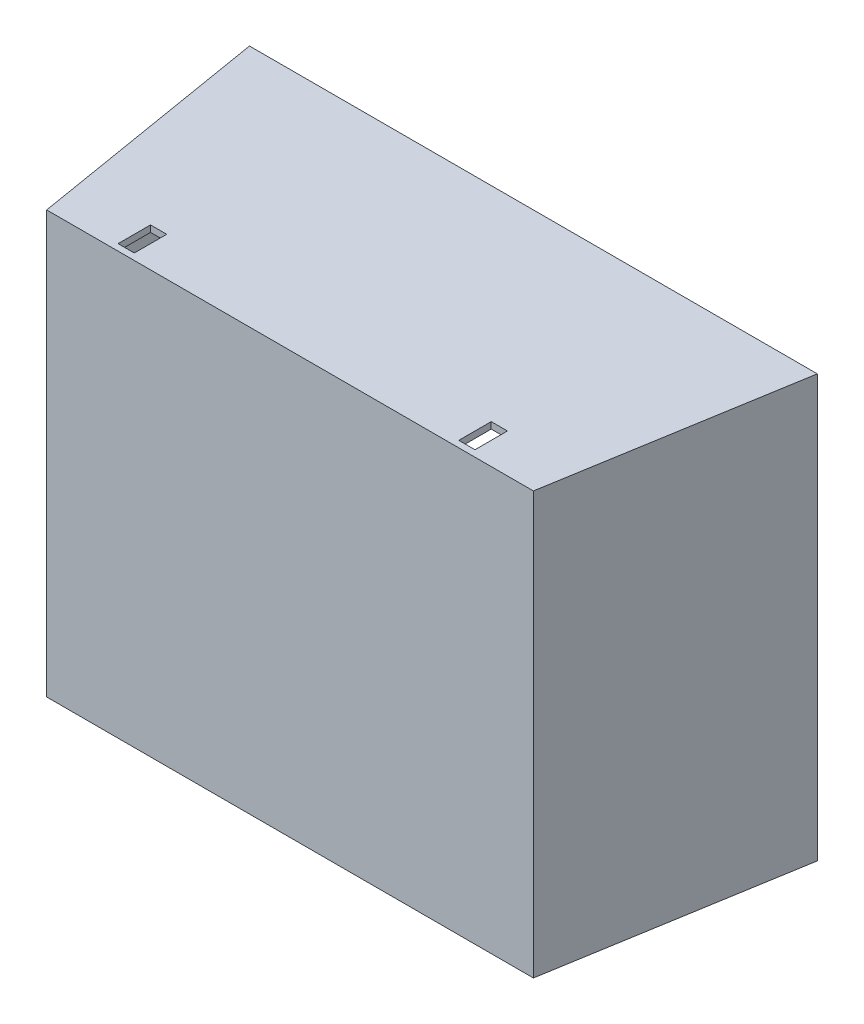
ISO-10303-21;
HEADER;
FILE_DESCRIPTION(('STEP AP214'),'2;1');
FILE_NAME('part.step','',(''),(''),'','','');
FILE_SCHEMA(('AUTOMOTIVE_DESIGN { 1 0 10303 214 1 1 1 1 }'));
ENDSEC;
DATA;
#1=APPLICATION_CONTEXT('core data for automotive mechanical design processes');
#2=APPLICATION_PROTOCOL_DEFINITION('international standard','automotive_design',2000,#1);
#3=PRODUCT_CONTEXT('',#1,'mechanical');
#4=PRODUCT('Part','Part','',(#3));
#5=PRODUCT_RELATED_PRODUCT_CATEGORY('part','',(#4));
#6=PRODUCT_DEFINITION_FORMATION('','',#4);
#7=PRODUCT_DEFINITION_CONTEXT('part definition',#1,'design');
#8=PRODUCT_DEFINITION('design','',#6,#7);
#9=PRODUCT_DEFINITION_SHAPE('','',#8);
#10=(LENGTH_UNIT() NAMED_UNIT(*) SI_UNIT(.MILLI.,.METRE.));
#11=(NAMED_UNIT(*) PLANE_ANGLE_UNIT() SI_UNIT($,.RADIAN.));
#12=(NAMED_UNIT(*) SI_UNIT($,.STERADIAN.) SOLID_ANGLE_UNIT());
#13=UNCERTAINTY_MEASURE_WITH_UNIT(LENGTH_MEASURE(1.E-05),#10,'distance_accuracy_value','');
#14=(GEOMETRIC_REPRESENTATION_CONTEXT(3) GLOBAL_UNCERTAINTY_ASSIGNED_CONTEXT((#13)) GLOBAL_UNIT_ASSIGNED_CONTEXT((#10,
#11,#12)) REPRESENTATION_CONTEXT('',''));
#15=CARTESIAN_POINT('',(0.,0.,0.));
#16=DIRECTION('',(0.,0.,1.));
#17=DIRECTION('',(1.,0.,0.));
#18=AXIS2_PLACEMENT_3D('',#15,#16,#17);
#19=CARTESIAN_POINT('',(175.,130.,0.));
#20=DIRECTION('',(0.,0.,1.));
#21=DIRECTION('',(1.,0.,0.));
#22=AXIS2_PLACEMENT_3D('',#19,#20,#21);
#23=PLANE('',#22);
#24=DIRECTION('',(-1.,0.,0.));
#25=VECTOR('',#24,1.);
#26=CARTESIAN_POINT('',(175.,-130.,0.));
#27=LINE('',#26,#25);
#28=CARTESIAN_POINT('',(175.,-130.,0.));
#29=VERTEX_POINT('',#28);
#30=CARTESIAN_POINT('',(-175.,-130.,0.));
#31=VERTEX_POINT('',#30);
#32=EDGE_CURVE('E407',#29,#31,#27,.T.);
#33=ORIENTED_EDGE('',*,*,#32,.T.);
#34=DIRECTION('',(0.,-1.,0.));
#35=VECTOR('',#34,1.);
#36=CARTESIAN_POINT('',(-175.,130.,0.));
#37=LINE('',#36,#35);
#38=CARTESIAN_POINT('',(-175.,130.,0.));
#39=VERTEX_POINT('',#38);
#40=EDGE_CURVE('E423',#39,#31,#37,.T.);
#41=ORIENTED_EDGE('',*,*,#40,.F.);
#42=DIRECTION('',(-1.,0.,0.));
#43=VECTOR('',#42,1.);
#44=CARTESIAN_POINT('',(175.,130.,0.));
#45=LINE('',#44,#43);
#46=CARTESIAN_POINT('',(175.,130.,0.));
#47=VERTEX_POINT('',#46);
#48=EDGE_CURVE('E392',#47,#39,#45,.T.);
#49=ORIENTED_EDGE('',*,*,#48,.F.);
#50=DIRECTION('',(0.,-1.,0.));
#51=VECTOR('',#50,1.);
#52=CARTESIAN_POINT('',(175.,130.,0.));
#53=LINE('',#52,#51);
#54=EDGE_CURVE('E426',#47,#29,#53,.T.);
#55=ORIENTED_EDGE('',*,*,#54,.T.);
#56=EDGE_LOOP('',(#33,#41,#49,#55));
#57=FACE_BOUND('',#56,.T.);
#58=DIRECTION('',(-1.,0.,0.));
#59=VECTOR('',#58,1.);
#60=CARTESIAN_POINT('',(175.,-126.,0.));
#61=LINE('',#60,#59);
#62=CARTESIAN_POINT('',(170.944824979801,-126.,0.));
#63=VERTEX_POINT('',#62);
#64=CARTESIAN_POINT('',(-170.944824979801,-126.,0.));
#65=VERTEX_POINT('',#64);
#66=EDGE_CURVE('E344',#63,#65,#61,.T.);
#67=ORIENTED_EDGE('',*,*,#66,.F.);
#68=DIRECTION('',(0.,-1.,0.));
#69=VECTOR('',#68,1.);
#70=CARTESIAN_POINT('',(170.944824979801,130.,0.));
#71=LINE('',#70,#69);
#72=CARTESIAN_POINT('',(170.944824979801,126.,0.));
#73=VERTEX_POINT('',#72);
#74=EDGE_CURVE('E376',#73,#63,#71,.T.);
#75=ORIENTED_EDGE('',*,*,#74,.F.);
#76=DIRECTION('',(-1.,0.,0.));
#77=VECTOR('',#76,1.);
#78=CARTESIAN_POINT('',(175.,126.,0.));
#79=LINE('',#78,#77);
#80=CARTESIAN_POINT('',(-170.944824979801,126.,0.));
#81=VERTEX_POINT('',#80);
#82=EDGE_CURVE('E348',#73,#81,#79,.T.);
#83=ORIENTED_EDGE('',*,*,#82,.T.);
#84=DIRECTION('',(0.,-1.,0.));
#85=VECTOR('',#84,1.);
#86=CARTESIAN_POINT('',(-170.944824979801,130.,0.));
#87=LINE('',#86,#85);
#88=EDGE_CURVE('E367',#81,#65,#87,.T.);
#89=ORIENTED_EDGE('',*,*,#88,.T.);
#90=EDGE_LOOP('',(#67,#75,#83,#89));
#91=FACE_BOUND('',#90,.T.);
#92=ADVANCED_FACE('F43',(#57,#91),#23,.F.);
#93=CARTESIAN_POINT('',(150.,130.,150.));
#94=DIRECTION('',(-0.986393923832144,0.,-0.164398987305357));
#95=DIRECTION('',(-0.164398987305357,0.,0.986393923832144));
#96=AXIS2_PLACEMENT_3D('',#93,#94,#95);
#97=PLANE('',#96);
#98=DIRECTION('',(0.164398987305357,0.,-0.986393923832144));
#99=VECTOR('',#98,1.);
#100=CARTESIAN_POINT('',(150.,-130.,150.));
#101=LINE('',#100,#99);
#102=CARTESIAN_POINT('',(150.,-130.,150.));
#103=VERTEX_POINT('',#102);
#104=EDGE_CURVE('E379',#103,#29,#101,.T.);
#105=ORIENTED_EDGE('',*,*,#104,.T.);
#106=ORIENTED_EDGE('',*,*,#54,.F.);
#107=DIRECTION('',(0.164398987305357,0.,-0.986393923832144));
#108=VECTOR('',#107,1.);
#109=CARTESIAN_POINT('',(150.,130.,150.));
#110=LINE('',#109,#108);
#111=CARTESIAN_POINT('',(150.,130.,150.));
#112=VERTEX_POINT('',#111);
#113=EDGE_CURVE('E388',#112,#47,#110,.T.);
#114=ORIENTED_EDGE('',*,*,#113,.F.);
#115=DIRECTION('',(0.,-1.,0.));
#116=VECTOR('',#115,1.);
#117=CARTESIAN_POINT('',(150.,130.,150.));
#118=LINE('',#117,#116);
#119=EDGE_CURVE('E403',#112,#103,#118,.T.);
#120=ORIENTED_EDGE('',*,*,#119,.T.);
#121=EDGE_LOOP('',(#105,#106,#114,#120));
#122=FACE_BOUND('',#121,.T.);
#123=ADVANCED_FACE('F45',(#122),#97,.F.);
#124=CARTESIAN_POINT('',(-150.,130.,150.));
#125=DIRECTION('',(-0.986393923832144,0.,0.164398987305357));
#126=DIRECTION('',(0.164398987305357,0.,0.986393923832144));
#127=AXIS2_PLACEMENT_3D('',#124,#125,#126);
#128=PLANE('',#127);
#129=DIRECTION('',(-0.164398987305357,0.,-0.986393923832144));
#130=VECTOR('',#129,1.);
#131=CARTESIAN_POINT('',(-150.,-130.,150.));
#132=LINE('',#131,#130);
#133=CARTESIAN_POINT('',(-150.,-130.,150.));
#134=VERTEX_POINT('',#133);
#135=EDGE_CURVE('E411',#134,#31,#132,.T.);
#136=ORIENTED_EDGE('',*,*,#135,.F.);
#137=DIRECTION('',(0.,-1.,0.));
#138=VECTOR('',#137,1.);
#139=CARTESIAN_POINT('',(-150.,130.,150.));
#140=LINE('',#139,#138);
#141=CARTESIAN_POINT('',(-150.,130.,150.));
#142=VERTEX_POINT('',#141);
#143=EDGE_CURVE('E420',#142,#134,#140,.T.);
#144=ORIENTED_EDGE('',*,*,#143,.F.);
#145=DIRECTION('',(-0.164398987305357,0.,-0.986393923832144));
#146=VECTOR('',#145,1.);
#147=CARTESIAN_POINT('',(-150.,130.,150.));
#148=LINE('',#147,#146);
#149=EDGE_CURVE('E396',#142,#39,#148,.T.);
#150=ORIENTED_EDGE('',*,*,#149,.T.);
#151=ORIENTED_EDGE('',*,*,#40,.T.);
#152=EDGE_LOOP('',(#136,#144,#150,#151));
#153=FACE_BOUND('',#152,.T.);
#154=ADVANCED_FACE('F502',(#153),#128,.T.);
#155=CARTESIAN_POINT('',(-150.,130.,150.));
#156=DIRECTION('',(0.,0.,-1.));
#157=DIRECTION('',(-1.,0.,0.));
#158=AXIS2_PLACEMENT_3D('',#155,#156,#157);
#159=PLANE('',#158);
#160=DIRECTION('',(1.,0.,0.));
#161=VECTOR('',#160,1.);
#162=CARTESIAN_POINT('',(-150.,-130.,150.));
#163=LINE('',#162,#161);
#164=EDGE_CURVE('E393',#134,#103,#163,.T.);
#165=ORIENTED_EDGE('',*,*,#164,.T.);
#166=ORIENTED_EDGE('',*,*,#119,.F.);
#167=DIRECTION('',(1.,0.,0.));
#168=VECTOR('',#167,1.);
#169=CARTESIAN_POINT('',(-150.,130.,150.));
#170=LINE('',#169,#168);
#171=EDGE_CURVE('E400',#142,#112,#170,.T.);
#172=ORIENTED_EDGE('',*,*,#171,.F.);
#173=ORIENTED_EDGE('',*,*,#143,.T.);
#174=EDGE_LOOP('',(#165,#166,#172,#173));
#175=FACE_BOUND('',#174,.T.);
#176=ADVANCED_FACE('F507',(#175),#159,.F.);
#177=CARTESIAN_POINT('',(0.,130.,0.));
#178=DIRECTION('',(0.,1.,0.));
#179=DIRECTION('',(0.,0.,1.));
#180=AXIS2_PLACEMENT_3D('',#177,#178,#179);
#181=PLANE('',#180);
#182=DIRECTION('',(0.,0.,1.));
#183=VECTOR('',#182,1.);
#184=CARTESIAN_POINT('',(100.,130.,146.));
#185=LINE('',#184,#183);
#186=CARTESIAN_POINT('',(100.,130.,126.));
#187=VERTEX_POINT('',#186);
#188=CARTESIAN_POINT('',(100.,130.,146.));
#189=VERTEX_POINT('',#188);
#190=EDGE_CURVE('E59',#187,#189,#185,.T.);
#191=ORIENTED_EDGE('',*,*,#190,.F.);
#192=DIRECTION('',(-1.,0.,0.));
#193=VECTOR('',#192,1.);
#194=CARTESIAN_POINT('',(100.,130.,126.));
#195=LINE('',#194,#193);
#196=CARTESIAN_POINT('',(110.,130.,126.));
#197=VERTEX_POINT('',#196);
#198=EDGE_CURVE('E237',#197,#187,#195,.T.);
#199=ORIENTED_EDGE('',*,*,#198,.F.);
#200=DIRECTION('',(0.,0.,-1.));
#201=VECTOR('',#200,1.);
#202=CARTESIAN_POINT('',(110.,130.,146.));
#203=LINE('',#202,#201);
#204=CARTESIAN_POINT('',(110.,130.,146.));
#205=VERTEX_POINT('',#204);
#206=EDGE_CURVE('E241',#205,#197,#203,.T.);
#207=ORIENTED_EDGE('',*,*,#206,.F.);
#208=DIRECTION('',(1.,0.,0.));
#209=VECTOR('',#208,1.);
#210=CARTESIAN_POINT('',(100.,130.,146.));
#211=LINE('',#210,#209);
#212=EDGE_CURVE('E250',#189,#205,#211,.T.);
#213=ORIENTED_EDGE('',*,*,#212,.F.);
#214=EDGE_LOOP('',(#191,#199,#207,#213));
#215=FACE_BOUND('',#214,.T.);
#216=DIRECTION('',(0.,0.,-1.));
#217=VECTOR('',#216,1.);
#218=CARTESIAN_POINT('',(-100.,130.,146.));
#219=LINE('',#218,#217);
#220=CARTESIAN_POINT('',(-100.,130.,146.));
#221=VERTEX_POINT('',#220);
#222=CARTESIAN_POINT('',(-100.,130.,126.));
#223=VERTEX_POINT('',#222);
#224=EDGE_CURVE('E67',#221,#223,#219,.T.);
#225=ORIENTED_EDGE('',*,*,#224,.F.);
#226=DIRECTION('',(1.,0.,0.));
#227=VECTOR('',#226,1.);
#228=CARTESIAN_POINT('',(-100.,130.,146.));
#229=LINE('',#228,#227);
#230=CARTESIAN_POINT('',(-110.,130.,146.));
#231=VERTEX_POINT('',#230);
#232=EDGE_CURVE('E288',#231,#221,#229,.T.);
#233=ORIENTED_EDGE('',*,*,#232,.F.);
#234=DIRECTION('',(0.,0.,1.));
#235=VECTOR('',#234,1.);
#236=CARTESIAN_POINT('',(-110.,130.,146.));
#237=LINE('',#236,#235);
#238=CARTESIAN_POINT('',(-110.,130.,126.));
#239=VERTEX_POINT('',#238);
#240=EDGE_CURVE('E292',#239,#231,#237,.T.);
#241=ORIENTED_EDGE('',*,*,#240,.F.);
#242=DIRECTION('',(-1.,0.,0.));
#243=VECTOR('',#242,1.);
#244=CARTESIAN_POINT('',(-100.,130.,126.));
#245=LINE('',#244,#243);
#246=EDGE_CURVE('E297',#223,#239,#245,.T.);
#247=ORIENTED_EDGE('',*,*,#246,.F.);
#248=EDGE_LOOP('',(#225,#233,#241,#247));
#249=FACE_BOUND('',#248,.T.);
#250=ORIENTED_EDGE('',*,*,#113,.T.);
#251=ORIENTED_EDGE('',*,*,#48,.T.);
#252=ORIENTED_EDGE('',*,*,#149,.F.);
#253=ORIENTED_EDGE('',*,*,#171,.T.);
#254=EDGE_LOOP('',(#250,#251,#252,#253));
#255=FACE_BOUND('',#254,.T.);
#256=ADVANCED_FACE('F511',(#215,#249,#255),#181,.T.);
#257=CARTESIAN_POINT('',(0.,-130.,0.));
#258=DIRECTION('',(0.,1.,0.));
#259=DIRECTION('',(0.,0.,1.));
#260=AXIS2_PLACEMENT_3D('',#257,#258,#259);
#261=PLANE('',#260);
#262=DIRECTION('',(-1.,0.,0.));
#263=VECTOR('',#262,1.);
#264=CARTESIAN_POINT('',(100.,-130.,126.));
#265=LINE('',#264,#263);
#266=CARTESIAN_POINT('',(110.,-130.,126.));
#267=VERTEX_POINT('',#266);
#268=CARTESIAN_POINT('',(100.,-130.,126.));
#269=VERTEX_POINT('',#268);
#270=EDGE_CURVE('E235',#267,#269,#265,.T.);
#271=ORIENTED_EDGE('',*,*,#270,.T.);
#272=DIRECTION('',(0.,0.,1.));
#273=VECTOR('',#272,1.);
#274=CARTESIAN_POINT('',(100.,-130.,146.));
#275=LINE('',#274,#273);
#276=CARTESIAN_POINT('',(100.,-130.,146.));
#277=VERTEX_POINT('',#276);
#278=EDGE_CURVE('E210',#269,#277,#275,.T.);
#279=ORIENTED_EDGE('',*,*,#278,.T.);
#280=DIRECTION('',(1.,0.,0.));
#281=VECTOR('',#280,1.);
#282=CARTESIAN_POINT('',(100.,-130.,146.));
#283=LINE('',#282,#281);
#284=CARTESIAN_POINT('',(110.,-130.,146.));
#285=VERTEX_POINT('',#284);
#286=EDGE_CURVE('E222',#277,#285,#283,.T.);
#287=ORIENTED_EDGE('',*,*,#286,.T.);
#288=DIRECTION('',(0.,0.,-1.));
#289=VECTOR('',#288,1.);
#290=CARTESIAN_POINT('',(110.,-130.,146.));
#291=LINE('',#290,#289);
#292=EDGE_CURVE('E230',#285,#267,#291,.T.);
#293=ORIENTED_EDGE('',*,*,#292,.T.);
#294=EDGE_LOOP('',(#271,#279,#287,#293));
#295=FACE_BOUND('',#294,.T.);
#296=DIRECTION('',(1.,0.,0.));
#297=VECTOR('',#296,1.);
#298=CARTESIAN_POINT('',(-100.,-130.,146.));
#299=LINE('',#298,#297);
#300=CARTESIAN_POINT('',(-110.,-130.,146.));
#301=VERTEX_POINT('',#300);
#302=CARTESIAN_POINT('',(-100.,-130.,146.));
#303=VERTEX_POINT('',#302);
#304=EDGE_CURVE('E272',#301,#303,#299,.T.);
#305=ORIENTED_EDGE('',*,*,#304,.T.);
#306=DIRECTION('',(0.,0.,-1.));
#307=VECTOR('',#306,1.);
#308=CARTESIAN_POINT('',(-100.,-130.,146.));
#309=LINE('',#308,#307);
#310=CARTESIAN_POINT('',(-100.,-130.,126.));
#311=VERTEX_POINT('',#310);
#312=EDGE_CURVE('E293',#303,#311,#309,.T.);
#313=ORIENTED_EDGE('',*,*,#312,.T.);
#314=DIRECTION('',(-1.,0.,0.));
#315=VECTOR('',#314,1.);
#316=CARTESIAN_POINT('',(-100.,-130.,126.));
#317=LINE('',#316,#315);
#318=CARTESIAN_POINT('',(-110.,-130.,126.));
#319=VERTEX_POINT('',#318);
#320=EDGE_CURVE('E310',#311,#319,#317,.T.);
#321=ORIENTED_EDGE('',*,*,#320,.T.);
#322=DIRECTION('',(0.,0.,1.));
#323=VECTOR('',#322,1.);
#324=CARTESIAN_POINT('',(-110.,-130.,146.));
#325=LINE('',#324,#323);
#326=EDGE_CURVE('E306',#319,#301,#325,.T.);
#327=ORIENTED_EDGE('',*,*,#326,.T.);
#328=EDGE_LOOP('',(#305,#313,#321,#327));
#329=FACE_BOUND('',#328,.T.);
#330=ORIENTED_EDGE('',*,*,#104,.F.);
#331=ORIENTED_EDGE('',*,*,#164,.F.);
#332=ORIENTED_EDGE('',*,*,#135,.T.);
#333=ORIENTED_EDGE('',*,*,#32,.F.);
#334=EDGE_LOOP('',(#330,#331,#332,#333));
#335=FACE_BOUND('',#334,.T.);
#336=ADVANCED_FACE('F232',(#295,#329,#335),#261,.F.);
#337=CARTESIAN_POINT('',(146.054424304671,130.,149.342404050779));
#338=DIRECTION('',(-0.986393923832144,0.,-0.164398987305357));
#339=DIRECTION('',(-0.164398987305357,0.,0.986393923832144));
#340=AXIS2_PLACEMENT_3D('',#337,#338,#339);
#341=PLANE('',#340);
#342=DIRECTION('',(0.164398987305357,0.,-0.986393923832144));
#343=VECTOR('',#342,1.);
#344=CARTESIAN_POINT('',(146.054424304671,-126.,149.342404050779));
#345=LINE('',#344,#343);
#346=CARTESIAN_POINT('',(146.611491646468,-126.,146.));
#347=VERTEX_POINT('',#346);
#348=EDGE_CURVE('E340',#347,#63,#345,.T.);
#349=ORIENTED_EDGE('',*,*,#348,.F.);
#350=DIRECTION('',(0.,-1.,0.));
#351=VECTOR('',#350,1.);
#352=CARTESIAN_POINT('',(146.611491646468,130.,146.));
#353=LINE('',#352,#351);
#354=CARTESIAN_POINT('',(146.611491646468,126.,146.));
#355=VERTEX_POINT('',#354);
#356=EDGE_CURVE('E350',#355,#347,#353,.T.);
#357=ORIENTED_EDGE('',*,*,#356,.F.);
#358=DIRECTION('',(0.164398987305357,0.,-0.986393923832144));
#359=VECTOR('',#358,1.);
#360=CARTESIAN_POINT('',(146.054424304671,126.,149.342404050779));
#361=LINE('',#360,#359);
#362=EDGE_CURVE('E345',#355,#73,#361,.T.);
#363=ORIENTED_EDGE('',*,*,#362,.T.);
#364=ORIENTED_EDGE('',*,*,#74,.T.);
#365=EDGE_LOOP('',(#349,#357,#363,#364));
#366=FACE_BOUND('',#365,.T.);
#367=ADVANCED_FACE('F459',(#366),#341,.T.);
#368=CARTESIAN_POINT('',(-146.054424304671,130.,149.342404050779));
#369=DIRECTION('',(-0.986393923832144,0.,0.164398987305357));
#370=DIRECTION('',(0.164398987305357,0.,0.986393923832144));
#371=AXIS2_PLACEMENT_3D('',#368,#369,#370);
#372=PLANE('',#371);
#373=DIRECTION('',(-0.164398987305357,0.,-0.986393923832144));
#374=VECTOR('',#373,1.);
#375=CARTESIAN_POINT('',(-146.054424304671,-126.,149.342404050779));
#376=LINE('',#375,#374);
#377=CARTESIAN_POINT('',(-146.611491646468,-126.,146.));
#378=VERTEX_POINT('',#377);
#379=EDGE_CURVE('E368',#378,#65,#376,.T.);
#380=ORIENTED_EDGE('',*,*,#379,.T.);
#381=ORIENTED_EDGE('',*,*,#88,.F.);
#382=DIRECTION('',(-0.164398987305357,0.,-0.986393923832144));
#383=VECTOR('',#382,1.);
#384=CARTESIAN_POINT('',(-146.054424304671,126.,149.342404050779));
#385=LINE('',#384,#383);
#386=CARTESIAN_POINT('',(-146.611491646468,126.,146.));
#387=VERTEX_POINT('',#386);
#388=EDGE_CURVE('E372',#387,#81,#385,.T.);
#389=ORIENTED_EDGE('',*,*,#388,.F.);
#390=DIRECTION('',(0.,-1.,0.));
#391=VECTOR('',#390,1.);
#392=CARTESIAN_POINT('',(-146.611491646468,130.,146.));
#393=LINE('',#392,#391);
#394=EDGE_CURVE('E354',#387,#378,#393,.T.);
#395=ORIENTED_EDGE('',*,*,#394,.T.);
#396=EDGE_LOOP('',(#380,#381,#389,#395));
#397=FACE_BOUND('',#396,.T.);
#398=ADVANCED_FACE('F465',(#397),#372,.F.);
#399=CARTESIAN_POINT('',(-150.,130.,146.));
#400=DIRECTION('',(0.,0.,-1.));
#401=DIRECTION('',(-1.,0.,0.));
#402=AXIS2_PLACEMENT_3D('',#399,#400,#401);
#403=PLANE('',#402);
#404=DIRECTION('',(1.,0.,0.));
#405=VECTOR('',#404,1.);
#406=CARTESIAN_POINT('',(-150.,126.,146.));
#407=LINE('',#406,#405);
#408=CARTESIAN_POINT('',(-110.,126.,146.));
#409=VERTEX_POINT('',#408);
#410=EDGE_CURVE('E355',#387,#409,#407,.T.);
#411=ORIENTED_EDGE('',*,*,#410,.T.);
#412=DIRECTION('',(0.,1.,0.));
#413=VECTOR('',#412,1.);
#414=CARTESIAN_POINT('',(-110.,-130.,146.));
#415=LINE('',#414,#413);
#416=EDGE_CURVE('E283',#409,#231,#415,.T.);
#417=ORIENTED_EDGE('',*,*,#416,.T.);
#418=ORIENTED_EDGE('',*,*,#232,.T.);
#419=DIRECTION('',(0.,1.,0.));
#420=VECTOR('',#419,1.);
#421=CARTESIAN_POINT('',(-100.,-130.,146.));
#422=LINE('',#421,#420);
#423=CARTESIAN_POINT('',(-100.,126.,146.));
#424=VERTEX_POINT('',#423);
#425=EDGE_CURVE('E287',#424,#221,#422,.T.);
#426=ORIENTED_EDGE('',*,*,#425,.F.);
#427=CARTESIAN_POINT('',(100.,126.,146.));
#428=VERTEX_POINT('',#427);
#429=EDGE_CURVE('E363',#424,#428,#407,.T.);
#430=ORIENTED_EDGE('',*,*,#429,.T.);
#431=DIRECTION('',(0.,1.,0.));
#432=VECTOR('',#431,1.);
#433=CARTESIAN_POINT('',(100.,-130.,146.));
#434=LINE('',#433,#432);
#435=EDGE_CURVE('E218',#428,#189,#434,.T.);
#436=ORIENTED_EDGE('',*,*,#435,.T.);
#437=ORIENTED_EDGE('',*,*,#212,.T.);
#438=DIRECTION('',(0.,1.,0.));
#439=VECTOR('',#438,1.);
#440=CARTESIAN_POINT('',(110.,-130.,146.));
#441=LINE('',#440,#439);
#442=CARTESIAN_POINT('',(110.,126.,146.));
#443=VERTEX_POINT('',#442);
#444=EDGE_CURVE('E217',#443,#205,#441,.T.);
#445=ORIENTED_EDGE('',*,*,#444,.F.);
#446=EDGE_CURVE('E364',#443,#355,#407,.T.);
#447=ORIENTED_EDGE('',*,*,#446,.T.);
#448=ORIENTED_EDGE('',*,*,#356,.T.);
#449=DIRECTION('',(1.,0.,0.));
#450=VECTOR('',#449,1.);
#451=CARTESIAN_POINT('',(-150.,-126.,146.));
#452=LINE('',#451,#450);
#453=CARTESIAN_POINT('',(110.,-126.,146.));
#454=VERTEX_POINT('',#453);
#455=EDGE_CURVE('E360',#454,#347,#452,.T.);
#456=ORIENTED_EDGE('',*,*,#455,.F.);
#457=EDGE_CURVE('E226',#285,#454,#441,.T.);
#458=ORIENTED_EDGE('',*,*,#457,.F.);
#459=ORIENTED_EDGE('',*,*,#286,.F.);
#460=CARTESIAN_POINT('',(100.,-126.,146.));
#461=VERTEX_POINT('',#460);
#462=EDGE_CURVE('E205',#277,#461,#434,.T.);
#463=ORIENTED_EDGE('',*,*,#462,.T.);
#464=CARTESIAN_POINT('',(-100.,-126.,146.));
#465=VERTEX_POINT('',#464);
#466=EDGE_CURVE('E359',#465,#461,#452,.T.);
#467=ORIENTED_EDGE('',*,*,#466,.F.);
#468=EDGE_CURVE('E284',#303,#465,#422,.T.);
#469=ORIENTED_EDGE('',*,*,#468,.F.);
#470=ORIENTED_EDGE('',*,*,#304,.F.);
#471=CARTESIAN_POINT('',(-110.,-126.,146.));
#472=VERTEX_POINT('',#471);
#473=EDGE_CURVE('E279',#301,#472,#415,.T.);
#474=ORIENTED_EDGE('',*,*,#473,.T.);
#475=EDGE_CURVE('E349',#378,#472,#452,.T.);
#476=ORIENTED_EDGE('',*,*,#475,.F.);
#477=ORIENTED_EDGE('',*,*,#394,.F.);
#478=EDGE_LOOP('',(#411,#417,#418,#426,#430,#436,#437,#445,#447,#448,#456,#458,#459,#463,#467,
#469,#470,#474,#476,#477));
#479=FACE_BOUND('',#478,.T.);
#480=ADVANCED_FACE('F224',(#479),#403,.T.);
#481=CARTESIAN_POINT('',(0.,126.,0.));
#482=DIRECTION('',(0.,1.,0.));
#483=DIRECTION('',(0.,0.,1.));
#484=AXIS2_PLACEMENT_3D('',#481,#482,#483);
#485=PLANE('',#484);
#486=DIRECTION('',(-1.,0.,0.));
#487=VECTOR('',#486,1.);
#488=CARTESIAN_POINT('',(0.,126.,126.));
#489=LINE('',#488,#487);
#490=CARTESIAN_POINT('',(110.,126.,126.));
#491=VERTEX_POINT('',#490);
#492=CARTESIAN_POINT('',(100.,126.,126.));
#493=VERTEX_POINT('',#492);
#494=EDGE_CURVE('E332',#491,#493,#489,.T.);
#495=ORIENTED_EDGE('',*,*,#494,.T.);
#496=DIRECTION('',(0.,0.,1.));
#497=VECTOR('',#496,1.);
#498=CARTESIAN_POINT('',(100.,126.,0.));
#499=LINE('',#498,#497);
#500=EDGE_CURVE('E336',#493,#428,#499,.T.);
#501=ORIENTED_EDGE('',*,*,#500,.T.);
#502=ORIENTED_EDGE('',*,*,#429,.F.);
#503=DIRECTION('',(0.,0.,-1.));
#504=VECTOR('',#503,1.);
#505=CARTESIAN_POINT('',(-100.,126.,0.));
#506=LINE('',#505,#504);
#507=CARTESIAN_POINT('',(-100.,126.,126.));
#508=VERTEX_POINT('',#507);
#509=EDGE_CURVE('E324',#424,#508,#506,.T.);
#510=ORIENTED_EDGE('',*,*,#509,.T.);
#511=DIRECTION('',(-1.,0.,0.));
#512=VECTOR('',#511,1.);
#513=CARTESIAN_POINT('',(0.,126.,126.));
#514=LINE('',#513,#512);
#515=CARTESIAN_POINT('',(-110.,126.,126.));
#516=VERTEX_POINT('',#515);
#517=EDGE_CURVE('E260',#508,#516,#514,.T.);
#518=ORIENTED_EDGE('',*,*,#517,.T.);
#519=DIRECTION('',(0.,0.,1.));
#520=VECTOR('',#519,1.);
#521=CARTESIAN_POINT('',(-110.,126.,0.));
#522=LINE('',#521,#520);
#523=EDGE_CURVE('E320',#516,#409,#522,.T.);
#524=ORIENTED_EDGE('',*,*,#523,.T.);
#525=ORIENTED_EDGE('',*,*,#410,.F.);
#526=ORIENTED_EDGE('',*,*,#388,.T.);
#527=ORIENTED_EDGE('',*,*,#82,.F.);
#528=ORIENTED_EDGE('',*,*,#362,.F.);
#529=ORIENTED_EDGE('',*,*,#446,.F.);
#530=DIRECTION('',(0.,0.,-1.));
#531=VECTOR('',#530,1.);
#532=CARTESIAN_POINT('',(110.,126.,0.));
#533=LINE('',#532,#531);
#534=EDGE_CURVE('E328',#443,#491,#533,.T.);
#535=ORIENTED_EDGE('',*,*,#534,.T.);
#536=EDGE_LOOP('',(#495,#501,#502,#510,#518,#524,#525,#526,#527,#528,#529,#535));
#537=FACE_BOUND('',#536,.T.);
#538=ADVANCED_FACE('F520',(#537),#485,.F.);
#539=CARTESIAN_POINT('',(0.,-126.,0.));
#540=DIRECTION('',(0.,1.,0.));
#541=DIRECTION('',(0.,0.,1.));
#542=AXIS2_PLACEMENT_3D('',#539,#540,#541);
#543=PLANE('',#542);
#544=DIRECTION('',(0.,0.,1.));
#545=VECTOR('',#544,1.);
#546=CARTESIAN_POINT('',(100.,-126.,0.));
#547=LINE('',#546,#545);
#548=CARTESIAN_POINT('',(100.,-126.,126.));
#549=VERTEX_POINT('',#548);
#550=EDGE_CURVE('E11',#549,#461,#547,.T.);
#551=ORIENTED_EDGE('',*,*,#550,.F.);
#552=DIRECTION('',(-1.,0.,0.));
#553=VECTOR('',#552,1.);
#554=CARTESIAN_POINT('',(0.,-126.,126.));
#555=LINE('',#554,#553);
#556=CARTESIAN_POINT('',(110.,-126.,126.));
#557=VERTEX_POINT('',#556);
#558=EDGE_CURVE('E52',#557,#549,#555,.T.);
#559=ORIENTED_EDGE('',*,*,#558,.F.);
#560=DIRECTION('',(0.,0.,-1.));
#561=VECTOR('',#560,1.);
#562=CARTESIAN_POINT('',(110.,-126.,0.));
#563=LINE('',#562,#561);
#564=EDGE_CURVE('E440',#454,#557,#563,.T.);
#565=ORIENTED_EDGE('',*,*,#564,.F.);
#566=ORIENTED_EDGE('',*,*,#455,.T.);
#567=ORIENTED_EDGE('',*,*,#348,.T.);
#568=ORIENTED_EDGE('',*,*,#66,.T.);
#569=ORIENTED_EDGE('',*,*,#379,.F.);
#570=ORIENTED_EDGE('',*,*,#475,.T.);
#571=DIRECTION('',(0.,0.,1.));
#572=VECTOR('',#571,1.);
#573=CARTESIAN_POINT('',(-110.,-126.,0.));
#574=LINE('',#573,#572);
#575=CARTESIAN_POINT('',(-110.,-126.,126.));
#576=VERTEX_POINT('',#575);
#577=EDGE_CURVE('E433',#576,#472,#574,.T.);
#578=ORIENTED_EDGE('',*,*,#577,.F.);
#579=DIRECTION('',(-1.,0.,0.));
#580=VECTOR('',#579,1.);
#581=CARTESIAN_POINT('',(0.,-126.,126.));
#582=LINE('',#581,#580);
#583=CARTESIAN_POINT('',(-100.,-126.,126.));
#584=VERTEX_POINT('',#583);
#585=EDGE_CURVE('E430',#584,#576,#582,.T.);
#586=ORIENTED_EDGE('',*,*,#585,.F.);
#587=DIRECTION('',(0.,0.,-1.));
#588=VECTOR('',#587,1.);
#589=CARTESIAN_POINT('',(-100.,-126.,0.));
#590=LINE('',#589,#588);
#591=EDGE_CURVE('E436',#465,#584,#590,.T.);
#592=ORIENTED_EDGE('',*,*,#591,.F.);
#593=ORIENTED_EDGE('',*,*,#466,.T.);
#594=EDGE_LOOP('',(#551,#559,#565,#566,#567,#568,#569,#570,#578,#586,#592,#593));
#595=FACE_BOUND('',#594,.T.);
#596=ADVANCED_FACE('F448',(#595),#543,.T.);
#597=CARTESIAN_POINT('',(-100.,-130.,126.));
#598=DIRECTION('',(0.,0.,-1.));
#599=DIRECTION('',(-1.,0.,0.));
#600=AXIS2_PLACEMENT_3D('',#597,#598,#599);
#601=PLANE('',#600);
#602=ORIENTED_EDGE('',*,*,#585,.T.);
#603=DIRECTION('',(0.,1.,0.));
#604=VECTOR('',#603,1.);
#605=CARTESIAN_POINT('',(-110.,-130.,126.));
#606=LINE('',#605,#604);
#607=EDGE_CURVE('E274',#319,#576,#606,.T.);
#608=ORIENTED_EDGE('',*,*,#607,.F.);
#609=ORIENTED_EDGE('',*,*,#320,.F.);
#610=DIRECTION('',(0.,1.,0.));
#611=VECTOR('',#610,1.);
#612=CARTESIAN_POINT('',(-100.,-130.,126.));
#613=LINE('',#612,#611);
#614=EDGE_CURVE('E269',#311,#584,#613,.T.);
#615=ORIENTED_EDGE('',*,*,#614,.T.);
#616=EDGE_LOOP('',(#602,#608,#609,#615));
#617=FACE_BOUND('',#616,.T.);
#618=ADVANCED_FACE('F476',(#617),#601,.F.);
#619=CARTESIAN_POINT('',(-110.,-130.,146.));
#620=DIRECTION('',(-1.,0.,0.));
#621=DIRECTION('',(0.,0.,1.));
#622=AXIS2_PLACEMENT_3D('',#619,#620,#621);
#623=PLANE('',#622);
#624=ORIENTED_EDGE('',*,*,#577,.T.);
#625=ORIENTED_EDGE('',*,*,#473,.F.);
#626=ORIENTED_EDGE('',*,*,#326,.F.);
#627=ORIENTED_EDGE('',*,*,#607,.T.);
#628=EDGE_LOOP('',(#624,#625,#626,#627));
#629=FACE_BOUND('',#628,.T.);
#630=ADVANCED_FACE('F472',(#629),#623,.F.);
#631=CARTESIAN_POINT('',(-100.,-130.,146.));
#632=DIRECTION('',(1.,0.,0.));
#633=DIRECTION('',(0.,0.,-1.));
#634=AXIS2_PLACEMENT_3D('',#631,#632,#633);
#635=PLANE('',#634);
#636=ORIENTED_EDGE('',*,*,#591,.T.);
#637=ORIENTED_EDGE('',*,*,#614,.F.);
#638=ORIENTED_EDGE('',*,*,#312,.F.);
#639=ORIENTED_EDGE('',*,*,#468,.T.);
#640=EDGE_LOOP('',(#636,#637,#638,#639));
#641=FACE_BOUND('',#640,.T.);
#642=ADVANCED_FACE('F480',(#641),#635,.F.);
#643=CARTESIAN_POINT('',(110.,-130.,146.));
#644=DIRECTION('',(1.,0.,0.));
#645=DIRECTION('',(0.,0.,-1.));
#646=AXIS2_PLACEMENT_3D('',#643,#644,#645);
#647=PLANE('',#646);
#648=ORIENTED_EDGE('',*,*,#564,.T.);
#649=DIRECTION('',(0.,1.,0.));
#650=VECTOR('',#649,1.);
#651=CARTESIAN_POINT('',(110.,-130.,126.));
#652=LINE('',#651,#650);
#653=EDGE_CURVE('E262',#267,#557,#652,.T.);
#654=ORIENTED_EDGE('',*,*,#653,.F.);
#655=ORIENTED_EDGE('',*,*,#292,.F.);
#656=ORIENTED_EDGE('',*,*,#457,.T.);
#657=EDGE_LOOP('',(#648,#654,#655,#656));
#658=FACE_BOUND('',#657,.T.);
#659=ADVANCED_FACE('F482',(#658),#647,.F.);
#660=CARTESIAN_POINT('',(100.,-130.,126.));
#661=DIRECTION('',(0.,0.,-1.));
#662=DIRECTION('',(-1.,0.,0.));
#663=AXIS2_PLACEMENT_3D('',#660,#661,#662);
#664=PLANE('',#663);
#665=ORIENTED_EDGE('',*,*,#558,.T.);
#666=DIRECTION('',(0.,1.,0.));
#667=VECTOR('',#666,1.);
#668=CARTESIAN_POINT('',(100.,-130.,126.));
#669=LINE('',#668,#667);
#670=EDGE_CURVE('E257',#269,#549,#669,.T.);
#671=ORIENTED_EDGE('',*,*,#670,.F.);
#672=ORIENTED_EDGE('',*,*,#270,.F.);
#673=ORIENTED_EDGE('',*,*,#653,.T.);
#674=EDGE_LOOP('',(#665,#671,#672,#673));
#675=FACE_BOUND('',#674,.T.);
#676=ADVANCED_FACE('F445',(#675),#664,.F.);
#677=CARTESIAN_POINT('',(100.,-130.,146.));
#678=DIRECTION('',(-1.,0.,0.));
#679=DIRECTION('',(0.,0.,1.));
#680=AXIS2_PLACEMENT_3D('',#677,#678,#679);
#681=PLANE('',#680);
#682=ORIENTED_EDGE('',*,*,#550,.T.);
#683=ORIENTED_EDGE('',*,*,#462,.F.);
#684=ORIENTED_EDGE('',*,*,#278,.F.);
#685=ORIENTED_EDGE('',*,*,#670,.T.);
#686=EDGE_LOOP('',(#682,#683,#684,#685));
#687=FACE_BOUND('',#686,.T.);
#688=ADVANCED_FACE('F207',(#687),#681,.F.);
#689=ORIENTED_EDGE('',*,*,#425,.T.);
#690=ORIENTED_EDGE('',*,*,#224,.T.);
#691=EDGE_CURVE('E273',#508,#223,#613,.T.);
#692=ORIENTED_EDGE('',*,*,#691,.F.);
#693=ORIENTED_EDGE('',*,*,#509,.F.);
#694=EDGE_LOOP('',(#689,#690,#692,#693));
#695=FACE_BOUND('',#694,.T.);
#696=ADVANCED_FACE('F484',(#695),#635,.F.);
#697=EDGE_CURVE('E278',#516,#239,#606,.T.);
#698=ORIENTED_EDGE('',*,*,#697,.T.);
#699=ORIENTED_EDGE('',*,*,#240,.T.);
#700=ORIENTED_EDGE('',*,*,#416,.F.);
#701=ORIENTED_EDGE('',*,*,#523,.F.);
#702=EDGE_LOOP('',(#698,#699,#700,#701));
#703=FACE_BOUND('',#702,.T.);
#704=ADVANCED_FACE('F493',(#703),#623,.F.);
#705=ORIENTED_EDGE('',*,*,#691,.T.);
#706=ORIENTED_EDGE('',*,*,#246,.T.);
#707=ORIENTED_EDGE('',*,*,#697,.F.);
#708=ORIENTED_EDGE('',*,*,#517,.F.);
#709=EDGE_LOOP('',(#705,#706,#707,#708));
#710=FACE_BOUND('',#709,.T.);
#711=ADVANCED_FACE('F530',(#710),#601,.F.);
#712=EDGE_CURVE('E261',#493,#187,#669,.T.);
#713=ORIENTED_EDGE('',*,*,#712,.T.);
#714=ORIENTED_EDGE('',*,*,#190,.T.);
#715=ORIENTED_EDGE('',*,*,#435,.F.);
#716=ORIENTED_EDGE('',*,*,#500,.F.);
#717=EDGE_LOOP('',(#713,#714,#715,#716));
#718=FACE_BOUND('',#717,.T.);
#719=ADVANCED_FACE('F534',(#718),#681,.F.);
#720=EDGE_CURVE('E266',#491,#197,#652,.T.);
#721=ORIENTED_EDGE('',*,*,#720,.T.);
#722=ORIENTED_EDGE('',*,*,#198,.T.);
#723=ORIENTED_EDGE('',*,*,#712,.F.);
#724=ORIENTED_EDGE('',*,*,#494,.F.);
#725=EDGE_LOOP('',(#721,#722,#723,#724));
#726=FACE_BOUND('',#725,.T.);
#727=ADVANCED_FACE('F540',(#726),#664,.F.);
#728=ORIENTED_EDGE('',*,*,#444,.T.);
#729=ORIENTED_EDGE('',*,*,#206,.T.);
#730=ORIENTED_EDGE('',*,*,#720,.F.);
#731=ORIENTED_EDGE('',*,*,#534,.F.);
#732=EDGE_LOOP('',(#728,#729,#730,#731));
#733=FACE_BOUND('',#732,.T.);
#734=ADVANCED_FACE('F491',(#733),#647,.F.);
#735=CLOSED_SHELL('',(#92,#123,#154,#176,#256,#336,#367,#398,#480,#538,#596,#618,#630,#642,#659,
#676,#688,#696,#704,#711,#719,#727,#734));
#736=MANIFOLD_SOLID_BREP('B2',#735);
#737=ADVANCED_BREP_SHAPE_REPRESENTATION('',(#18,#736),#14);
#738=SHAPE_DEFINITION_REPRESENTATION(#9,#737);
ENDSEC;
END-ISO-10303-21;
